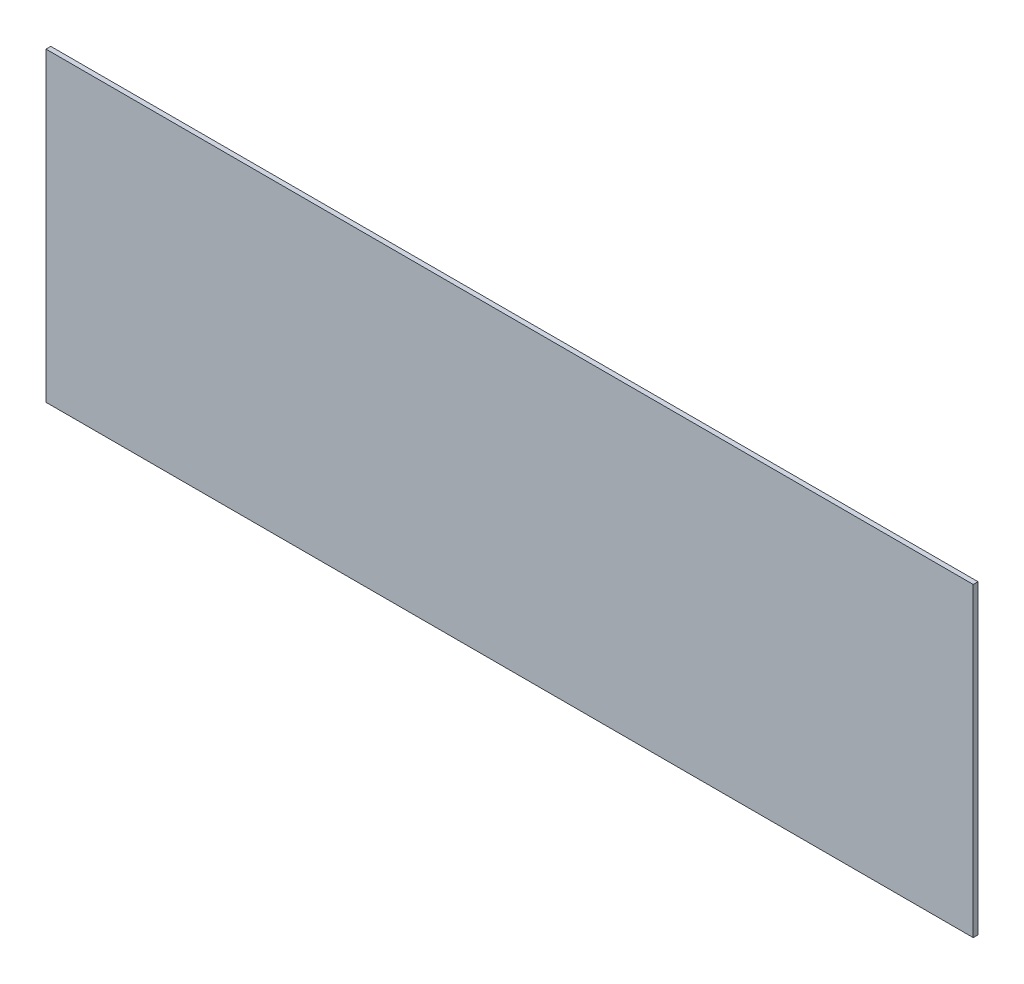
ISO-10303-21;
HEADER;
FILE_DESCRIPTION(('STEP AP214'),'2;1');
FILE_NAME('part.step','',(''),(''),'','','');
FILE_SCHEMA(('AUTOMOTIVE_DESIGN { 1 0 10303 214 1 1 1 1 }'));
ENDSEC;
DATA;
#1=APPLICATION_CONTEXT('core data for automotive mechanical design processes');
#2=APPLICATION_PROTOCOL_DEFINITION('international standard','automotive_design',2000,#1);
#3=PRODUCT_CONTEXT('',#1,'mechanical');
#4=PRODUCT('Part','Part','',(#3));
#5=PRODUCT_RELATED_PRODUCT_CATEGORY('part','',(#4));
#6=PRODUCT_DEFINITION_FORMATION('','',#4);
#7=PRODUCT_DEFINITION_CONTEXT('part definition',#1,'design');
#8=PRODUCT_DEFINITION('design','',#6,#7);
#9=PRODUCT_DEFINITION_SHAPE('','',#8);
#10=(LENGTH_UNIT() NAMED_UNIT(*) SI_UNIT(.MILLI.,.METRE.));
#11=(NAMED_UNIT(*) PLANE_ANGLE_UNIT() SI_UNIT($,.RADIAN.));
#12=(NAMED_UNIT(*) SI_UNIT($,.STERADIAN.) SOLID_ANGLE_UNIT());
#13=UNCERTAINTY_MEASURE_WITH_UNIT(LENGTH_MEASURE(1.E-05),#10,'distance_accuracy_value','');
#14=(GEOMETRIC_REPRESENTATION_CONTEXT(3) GLOBAL_UNCERTAINTY_ASSIGNED_CONTEXT((#13)) GLOBAL_UNIT_ASSIGNED_CONTEXT((#10,
#11,#12)) REPRESENTATION_CONTEXT('',''));
#15=CARTESIAN_POINT('',(0.,0.,0.));
#16=DIRECTION('',(0.,0.,1.));
#17=DIRECTION('',(1.,0.,0.));
#18=AXIS2_PLACEMENT_3D('',#15,#16,#17);
#19=CARTESIAN_POINT('',(307.975,-101.6,3.175));
#20=DIRECTION('',(-1.,0.,0.));
#21=DIRECTION('',(0.,0.,1.));
#22=AXIS2_PLACEMENT_3D('',#19,#20,#21);
#23=PLANE('',#22);
#24=DIRECTION('',(0.,1.,0.));
#25=VECTOR('',#24,1.);
#26=CARTESIAN_POINT('',(307.975,-101.6,0.));
#27=LINE('',#26,#25);
#28=CARTESIAN_POINT('',(307.975,-101.6,0.));
#29=VERTEX_POINT('',#28);
#30=CARTESIAN_POINT('',(307.975,101.6,0.));
#31=VERTEX_POINT('',#30);
#32=EDGE_CURVE('E102',#29,#31,#27,.T.);
#33=ORIENTED_EDGE('',*,*,#32,.T.);
#34=DIRECTION('',(0.,0.,-1.));
#35=VECTOR('',#34,1.);
#36=CARTESIAN_POINT('',(307.975,101.6,3.175));
#37=LINE('',#36,#35);
#38=CARTESIAN_POINT('',(307.975,101.6,3.175));
#39=VERTEX_POINT('',#38);
#40=EDGE_CURVE('E11',#39,#31,#37,.T.);
#41=ORIENTED_EDGE('',*,*,#40,.F.);
#42=DIRECTION('',(0.,1.,0.));
#43=VECTOR('',#42,1.);
#44=CARTESIAN_POINT('',(307.975,-101.6,3.175));
#45=LINE('',#44,#43);
#46=CARTESIAN_POINT('',(307.975,-101.6,3.175));
#47=VERTEX_POINT('',#46);
#48=EDGE_CURVE('E90',#47,#39,#45,.T.);
#49=ORIENTED_EDGE('',*,*,#48,.F.);
#50=DIRECTION('',(0.,0.,-1.));
#51=VECTOR('',#50,1.);
#52=CARTESIAN_POINT('',(307.975,-101.6,3.175));
#53=LINE('',#52,#51);
#54=EDGE_CURVE('E98',#47,#29,#53,.T.);
#55=ORIENTED_EDGE('',*,*,#54,.T.);
#56=EDGE_LOOP('',(#33,#41,#49,#55));
#57=FACE_BOUND('',#56,.T.);
#58=ADVANCED_FACE('F39',(#57),#23,.F.);
#59=CARTESIAN_POINT('',(-307.975,101.6,3.175));
#60=DIRECTION('',(0.,-1.,0.));
#61=DIRECTION('',(0.,0.,-1.));
#62=AXIS2_PLACEMENT_3D('',#59,#60,#61);
#63=PLANE('',#62);
#64=DIRECTION('',(-1.,0.,0.));
#65=VECTOR('',#64,1.);
#66=CARTESIAN_POINT('',(-307.975,101.6,0.));
#67=LINE('',#66,#65);
#68=CARTESIAN_POINT('',(-307.975,101.6,0.));
#69=VERTEX_POINT('',#68);
#70=EDGE_CURVE('E94',#31,#69,#67,.T.);
#71=ORIENTED_EDGE('',*,*,#70,.T.);
#72=DIRECTION('',(0.,0.,-1.));
#73=VECTOR('',#72,1.);
#74=CARTESIAN_POINT('',(-307.975,101.6,3.175));
#75=LINE('',#74,#73);
#76=CARTESIAN_POINT('',(-307.975,101.6,3.175));
#77=VERTEX_POINT('',#76);
#78=EDGE_CURVE('E47',#77,#69,#75,.T.);
#79=ORIENTED_EDGE('',*,*,#78,.F.);
#80=DIRECTION('',(-1.,0.,0.));
#81=VECTOR('',#80,1.);
#82=CARTESIAN_POINT('',(-307.975,101.6,3.175));
#83=LINE('',#82,#81);
#84=EDGE_CURVE('E85',#39,#77,#83,.T.);
#85=ORIENTED_EDGE('',*,*,#84,.F.);
#86=ORIENTED_EDGE('',*,*,#40,.T.);
#87=EDGE_LOOP('',(#71,#79,#85,#86));
#88=FACE_BOUND('',#87,.T.);
#89=ADVANCED_FACE('F93',(#88),#63,.F.);
#90=CARTESIAN_POINT('',(-307.975,-101.6,3.175));
#91=DIRECTION('',(1.,0.,0.));
#92=DIRECTION('',(0.,0.,-1.));
#93=AXIS2_PLACEMENT_3D('',#90,#91,#92);
#94=PLANE('',#93);
#95=DIRECTION('',(0.,-1.,0.));
#96=VECTOR('',#95,1.);
#97=CARTESIAN_POINT('',(-307.975,-101.6,0.));
#98=LINE('',#97,#96);
#99=CARTESIAN_POINT('',(-307.975,-101.6,0.));
#100=VERTEX_POINT('',#99);
#101=EDGE_CURVE('E72',#69,#100,#98,.T.);
#102=ORIENTED_EDGE('',*,*,#101,.T.);
#103=DIRECTION('',(0.,0.,-1.));
#104=VECTOR('',#103,1.);
#105=CARTESIAN_POINT('',(-307.975,-101.6,3.175));
#106=LINE('',#105,#104);
#107=CARTESIAN_POINT('',(-307.975,-101.6,3.175));
#108=VERTEX_POINT('',#107);
#109=EDGE_CURVE('E95',#108,#100,#106,.T.);
#110=ORIENTED_EDGE('',*,*,#109,.F.);
#111=DIRECTION('',(0.,-1.,0.));
#112=VECTOR('',#111,1.);
#113=CARTESIAN_POINT('',(-307.975,-101.6,3.175));
#114=LINE('',#113,#112);
#115=EDGE_CURVE('E88',#77,#108,#114,.T.);
#116=ORIENTED_EDGE('',*,*,#115,.F.);
#117=ORIENTED_EDGE('',*,*,#78,.T.);
#118=EDGE_LOOP('',(#102,#110,#116,#117));
#119=FACE_BOUND('',#118,.T.);
#120=ADVANCED_FACE('F96',(#119),#94,.F.);
#121=CARTESIAN_POINT('',(-307.975,-101.6,3.175));
#122=DIRECTION('',(0.,1.,0.));
#123=DIRECTION('',(0.,0.,1.));
#124=AXIS2_PLACEMENT_3D('',#121,#122,#123);
#125=PLANE('',#124);
#126=DIRECTION('',(1.,0.,0.));
#127=VECTOR('',#126,1.);
#128=CARTESIAN_POINT('',(-307.975,-101.6,0.));
#129=LINE('',#128,#127);
#130=EDGE_CURVE('E78',#100,#29,#129,.T.);
#131=ORIENTED_EDGE('',*,*,#130,.T.);
#132=ORIENTED_EDGE('',*,*,#54,.F.);
#133=DIRECTION('',(1.,0.,0.));
#134=VECTOR('',#133,1.);
#135=CARTESIAN_POINT('',(-307.975,-101.6,3.175));
#136=LINE('',#135,#134);
#137=EDGE_CURVE('E55',#108,#47,#136,.T.);
#138=ORIENTED_EDGE('',*,*,#137,.F.);
#139=ORIENTED_EDGE('',*,*,#109,.T.);
#140=EDGE_LOOP('',(#131,#132,#138,#139));
#141=FACE_BOUND('',#140,.T.);
#142=ADVANCED_FACE('F109',(#141),#125,.F.);
#143=CARTESIAN_POINT('',(0.,0.,3.175));
#144=DIRECTION('',(0.,0.,-1.));
#145=DIRECTION('',(-1.,0.,0.));
#146=AXIS2_PLACEMENT_3D('',#143,#144,#145);
#147=PLANE('',#146);
#148=ORIENTED_EDGE('',*,*,#48,.T.);
#149=ORIENTED_EDGE('',*,*,#84,.T.);
#150=ORIENTED_EDGE('',*,*,#115,.T.);
#151=ORIENTED_EDGE('',*,*,#137,.T.);
#152=EDGE_LOOP('',(#148,#149,#150,#151));
#153=FACE_BOUND('',#152,.T.);
#154=ADVANCED_FACE('F86',(#153),#147,.F.);
#155=CARTESIAN_POINT('',(0.,0.,0.));
#156=DIRECTION('',(0.,0.,-1.));
#157=DIRECTION('',(-1.,0.,0.));
#158=AXIS2_PLACEMENT_3D('',#155,#156,#157);
#159=PLANE('',#158);
#160=ORIENTED_EDGE('',*,*,#32,.F.);
#161=ORIENTED_EDGE('',*,*,#130,.F.);
#162=ORIENTED_EDGE('',*,*,#101,.F.);
#163=ORIENTED_EDGE('',*,*,#70,.F.);
#164=EDGE_LOOP('',(#160,#161,#162,#163));
#165=FACE_BOUND('',#164,.T.);
#166=ADVANCED_FACE('F112',(#165),#159,.T.);
#167=CLOSED_SHELL('',(#58,#89,#120,#142,#154,#166));
#168=MANIFOLD_SOLID_BREP('B2',#167);
#169=ADVANCED_BREP_SHAPE_REPRESENTATION('',(#18,#168),#14);
#170=SHAPE_DEFINITION_REPRESENTATION(#9,#169);
ENDSEC;
END-ISO-10303-21;
